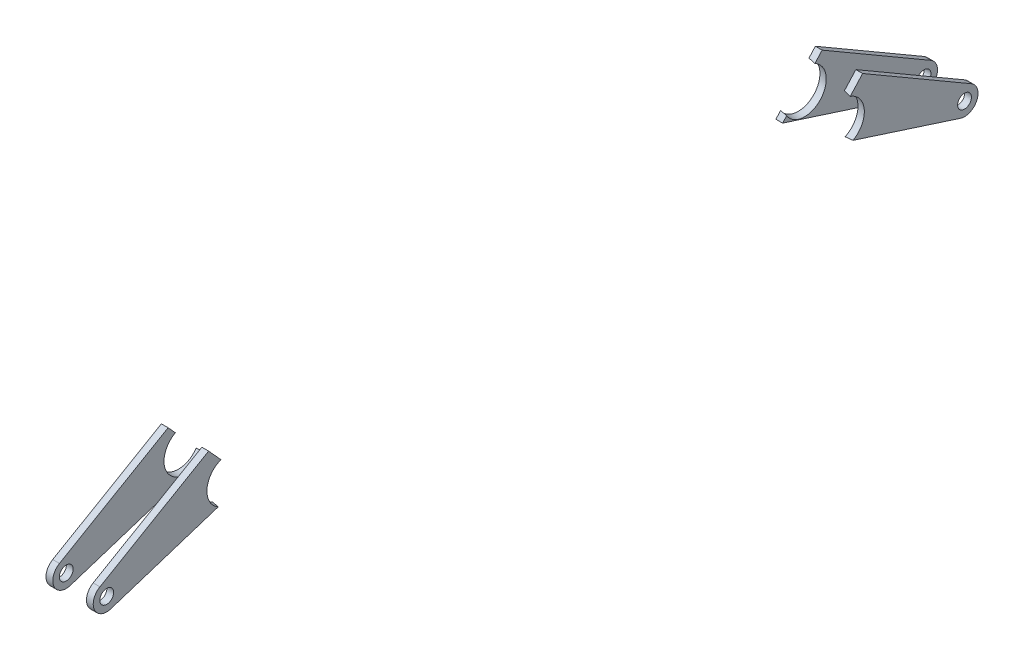
ISO-10303-21;
HEADER;
FILE_DESCRIPTION(('STEP AP214'),'2;1');
FILE_NAME('part.step','',(''),(''),'','','');
FILE_SCHEMA(('AUTOMOTIVE_DESIGN { 1 0 10303 214 1 1 1 1 }'));
ENDSEC;
DATA;
#1=APPLICATION_CONTEXT('core data for automotive mechanical design processes');
#2=APPLICATION_PROTOCOL_DEFINITION('international standard','automotive_design',2000,#1);
#3=PRODUCT_CONTEXT('',#1,'mechanical');
#4=PRODUCT('Part','Part','',(#3));
#5=PRODUCT_RELATED_PRODUCT_CATEGORY('part','',(#4));
#6=PRODUCT_DEFINITION_FORMATION('','',#4);
#7=PRODUCT_DEFINITION_CONTEXT('part definition',#1,'design');
#8=PRODUCT_DEFINITION('design','',#6,#7);
#9=PRODUCT_DEFINITION_SHAPE('','',#8);
#10=(LENGTH_UNIT() NAMED_UNIT(*) SI_UNIT(.MILLI.,.METRE.));
#11=(NAMED_UNIT(*) PLANE_ANGLE_UNIT() SI_UNIT($,.RADIAN.));
#12=(NAMED_UNIT(*) SI_UNIT($,.STERADIAN.) SOLID_ANGLE_UNIT());
#13=UNCERTAINTY_MEASURE_WITH_UNIT(LENGTH_MEASURE(1.E-05),#10,'distance_accuracy_value','');
#14=(GEOMETRIC_REPRESENTATION_CONTEXT(3) GLOBAL_UNCERTAINTY_ASSIGNED_CONTEXT((#13)) GLOBAL_UNIT_ASSIGNED_CONTEXT((#10,
#11,#12)) REPRESENTATION_CONTEXT('',''));
#15=CARTESIAN_POINT('',(0.,0.,0.));
#16=DIRECTION('',(0.,0.,1.));
#17=DIRECTION('',(1.,0.,0.));
#18=AXIS2_PLACEMENT_3D('',#15,#16,#17);
#19=CARTESIAN_POINT('',(946.,190.337125511046,-209.466012456477));
#20=DIRECTION('',(0.,0.672505400933836,-0.740092214331985));
#21=DIRECTION('',(0.,-0.740092214331985,-0.672505400933836));
#22=AXIS2_PLACEMENT_3D('',#19,#20,#21);
#23=PLANE('',#22);
#24=DIRECTION('',(0.,-0.740092214331985,-0.672505400933836));
#25=VECTOR('',#24,1.);
#26=CARTESIAN_POINT('',(950.,190.337125511046,-209.466012456477));
#27=LINE('',#26,#25);
#28=CARTESIAN_POINT('',(950.,611.014843824837,172.794511489047));
#29=VERTEX_POINT('',#28);
#30=CARTESIAN_POINT('',(950.,608.387814650427,170.40738827117));
#31=VERTEX_POINT('',#30);
#32=EDGE_CURVE('E109',#29,#31,#27,.T.);
#33=ORIENTED_EDGE('',*,*,#32,.T.);
#34=DIRECTION('',(1.,0.,0.));
#35=VECTOR('',#34,1.);
#36=CARTESIAN_POINT('',(946.,608.387814650427,170.40738827117));
#37=LINE('',#36,#35);
#38=CARTESIAN_POINT('',(946.,608.387814650427,170.40738827117));
#39=VERTEX_POINT('',#38);
#40=EDGE_CURVE('E146',#39,#31,#37,.T.);
#41=ORIENTED_EDGE('',*,*,#40,.F.);
#42=DIRECTION('',(0.,-0.740092214331985,-0.672505400933836));
#43=VECTOR('',#42,1.);
#44=CARTESIAN_POINT('',(946.,190.337125511046,-209.466012456477));
#45=LINE('',#44,#43);
#46=CARTESIAN_POINT('',(946.,611.448586895078,173.18864420887));
#47=VERTEX_POINT('',#46);
#48=EDGE_CURVE('E144',#47,#39,#45,.T.);
#49=ORIENTED_EDGE('',*,*,#48,.F.);
#50=CARTESIAN_POINT('',(902.408874088127,626.001437412493,186.412497105063));
#51=DIRECTION('',(0.,-0.672505400933836,0.740092214331985));
#52=DIRECTION('',(0.986680698233495,-0.120390051706131,-0.109395773152613));
#53=AXIS2_PLACEMENT_3D('',#50,#51,#52);
#54=ELLIPSE('',#53,188.081374371091,12.7000000000001);
#55=EDGE_CURVE('E118',#29,#47,#54,.F.);
#56=ORIENTED_EDGE('',*,*,#55,.F.);
#57=EDGE_LOOP('',(#33,#41,#49,#56));
#58=FACE_BOUND('',#57,.T.);
#59=ADVANCED_FACE('F50',(#58),#23,.T.);
#60=CARTESIAN_POINT('',(946.,589.782273930001,254.22347738));
#61=DIRECTION('',(1.,0.,0.));
#62=DIRECTION('',(0.,0.,1.));
#63=AXIS2_PLACEMENT_3D('',#60,#61,#62);
#64=CYLINDRICAL_SURFACE('',#63,8.00000000000001);
#65=CARTESIAN_POINT('',(950.,589.782273930001,254.22347738));
#66=DIRECTION('',(1.,0.,0.));
#67=DIRECTION('',(0.,0.,-1.));
#68=AXIS2_PLACEMENT_3D('',#65,#66,#67);
#69=CIRCLE('',#68,8.00000000000001);
#70=CARTESIAN_POINT('',(950.,596.698287663126,258.244516305853));
#71=VERTEX_POINT('',#70);
#72=CARTESIAN_POINT('',(950.,582.167895092533,251.769656905816));
#73=VERTEX_POINT('',#72);
#74=EDGE_CURVE('E149',#71,#73,#69,.T.);
#75=ORIENTED_EDGE('',*,*,#74,.F.);
#76=DIRECTION('',(1.,0.,0.));
#77=VECTOR('',#76,1.);
#78=CARTESIAN_POINT('',(946.,596.698287663126,258.244516305853));
#79=LINE('',#78,#77);
#80=CARTESIAN_POINT('',(946.,596.698287663126,258.244516305853));
#81=VERTEX_POINT('',#80);
#82=EDGE_CURVE('E154',#81,#71,#79,.T.);
#83=ORIENTED_EDGE('',*,*,#82,.F.);
#84=CARTESIAN_POINT('',(946.,589.782273930001,254.22347738));
#85=DIRECTION('',(1.,0.,0.));
#86=DIRECTION('',(0.,0.,-1.));
#87=AXIS2_PLACEMENT_3D('',#84,#85,#86);
#88=CIRCLE('',#87,8.00000000000001);
#89=CARTESIAN_POINT('',(946.,582.167895092533,251.769656905816));
#90=VERTEX_POINT('',#89);
#91=EDGE_CURVE('E126',#81,#90,#88,.T.);
#92=ORIENTED_EDGE('',*,*,#91,.T.);
#93=DIRECTION('',(1.,0.,0.));
#94=VECTOR('',#93,1.);
#95=CARTESIAN_POINT('',(946.,582.167895092533,251.769656905816));
#96=LINE('',#95,#94);
#97=EDGE_CURVE('E143',#90,#73,#96,.T.);
#98=ORIENTED_EDGE('',*,*,#97,.T.);
#99=EDGE_LOOP('',(#75,#83,#92,#98));
#100=FACE_BOUND('',#99,.T.);
#101=ADVANCED_FACE('F164',(#100),#64,.T.);
#102=CARTESIAN_POINT('',(946.,600.898752077459,193.646480196607));
#103=DIRECTION('',(0.,-0.951797354683466,-0.306727559272974));
#104=DIRECTION('',(0.,-0.306727559272974,0.951797354683466));
#105=AXIS2_PLACEMENT_3D('',#102,#103,#104);
#106=PLANE('',#105);
#107=DIRECTION('',(0.,-0.306727559272974,0.951797354683466));
#108=VECTOR('',#107,1.);
#109=CARTESIAN_POINT('',(950.,600.898752077459,193.646480196607));
#110=LINE('',#109,#108);
#111=EDGE_CURVE('E124',#31,#73,#110,.T.);
#112=ORIENTED_EDGE('',*,*,#111,.T.);
#113=ORIENTED_EDGE('',*,*,#97,.F.);
#114=DIRECTION('',(0.,-0.306727559272974,0.951797354683466));
#115=VECTOR('',#114,1.);
#116=CARTESIAN_POINT('',(946.,600.898752077459,193.646480196607));
#117=LINE('',#116,#115);
#118=EDGE_CURVE('E139',#39,#90,#117,.T.);
#119=ORIENTED_EDGE('',*,*,#118,.F.);
#120=ORIENTED_EDGE('',*,*,#40,.T.);
#121=EDGE_LOOP('',(#112,#113,#119,#120));
#122=FACE_BOUND('',#121,.T.);
#123=ADVANCED_FACE('F152',(#122),#106,.T.);
#124=CARTESIAN_POINT('',(946.,634.154667448058,193.821156631259));
#125=VERTEX_POINT('',#124);
#126=CARTESIAN_POINT('',(946.,629.966541176903,190.015499062375));
#127=VERTEX_POINT('',#126);
#128=EDGE_CURVE('E116',#125,#127,#45,.T.);
#129=ORIENTED_EDGE('',*,*,#128,.F.);
#130=DIRECTION('',(1.,0.,0.));
#131=VECTOR('',#130,1.);
#132=CARTESIAN_POINT('',(946.,634.154667448058,193.821156631259));
#133=LINE('',#132,#131);
#134=CARTESIAN_POINT('',(950.,634.154667448058,193.821156631259));
#135=VERTEX_POINT('',#134);
#136=EDGE_CURVE('E120',#125,#135,#133,.T.);
#137=ORIENTED_EDGE('',*,*,#136,.T.);
#138=CARTESIAN_POINT('',(950.,629.428733590305,189.526805221734));
#139=VERTEX_POINT('',#138);
#140=EDGE_CURVE('E54',#135,#139,#27,.T.);
#141=ORIENTED_EDGE('',*,*,#140,.T.);
#142=EDGE_CURVE('E111',#127,#139,#54,.F.);
#143=ORIENTED_EDGE('',*,*,#142,.F.);
#144=EDGE_LOOP('',(#129,#137,#141,#143));
#145=FACE_BOUND('',#144,.T.);
#146=ADVANCED_FACE('F52',(#145),#23,.T.);
#147=CARTESIAN_POINT('',(946.,589.782273930001,254.22347738));
#148=DIRECTION('',(1.,0.,0.));
#149=DIRECTION('',(0.,0.,1.));
#150=AXIS2_PLACEMENT_3D('',#147,#148,#149);
#151=CYLINDRICAL_SURFACE('',#150,4.1);
#152=CARTESIAN_POINT('',(946.,589.782273930001,254.22347738));
#153=DIRECTION('',(1.,0.,0.));
#154=DIRECTION('',(0.,0.,-1.));
#155=AXIS2_PLACEMENT_3D('',#152,#153,#154);
#156=CIRCLE('',#155,4.1);
#157=CARTESIAN_POINT('',(946.,589.782273930001,250.12347738));
#158=VERTEX_POINT('',#157);
#159=EDGE_CURVE('E115',#158,#158,#156,.T.);
#160=ORIENTED_EDGE('',*,*,#159,.F.);
#161=EDGE_LOOP('',(#160));
#162=FACE_BOUND('',#161,.T.);
#163=CARTESIAN_POINT('',(950.,589.782273930001,254.22347738));
#164=DIRECTION('',(1.,0.,0.));
#165=DIRECTION('',(0.,0.,-1.));
#166=AXIS2_PLACEMENT_3D('',#163,#164,#165);
#167=CIRCLE('',#166,4.1);
#168=CARTESIAN_POINT('',(950.,589.782273930001,250.12347738));
#169=VERTEX_POINT('',#168);
#170=EDGE_CURVE('E60',#169,#169,#167,.T.);
#171=ORIENTED_EDGE('',*,*,#170,.T.);
#172=EDGE_LOOP('',(#171));
#173=FACE_BOUND('',#172,.T.);
#174=ADVANCED_FACE('F173',(#162,#173),#151,.F.);
#175=CARTESIAN_POINT('',(946.,558.163891278211,324.522018093342));
#176=DIRECTION('',(0.,0.864501716640661,0.502629865731584));
#177=DIRECTION('',(0.,0.502629865731584,-0.864501716640661));
#178=AXIS2_PLACEMENT_3D('',#175,#176,#177);
#179=PLANE('',#178);
#180=DIRECTION('',(0.,0.502629865731584,-0.864501716640661));
#181=VECTOR('',#180,1.);
#182=CARTESIAN_POINT('',(950.,558.163891278211,324.522018093342));
#183=LINE('',#182,#181);
#184=EDGE_CURVE('E121',#71,#135,#183,.T.);
#185=ORIENTED_EDGE('',*,*,#184,.T.);
#186=ORIENTED_EDGE('',*,*,#136,.F.);
#187=DIRECTION('',(0.,0.502629865731584,-0.864501716640661));
#188=VECTOR('',#187,1.);
#189=CARTESIAN_POINT('',(946.,558.163891278211,324.522018093342));
#190=LINE('',#189,#188);
#191=EDGE_CURVE('E142',#81,#125,#190,.T.);
#192=ORIENTED_EDGE('',*,*,#191,.F.);
#193=ORIENTED_EDGE('',*,*,#82,.T.);
#194=EDGE_LOOP('',(#185,#186,#192,#193));
#195=FACE_BOUND('',#194,.T.);
#196=ADVANCED_FACE('F163',(#195),#179,.T.);
#197=CARTESIAN_POINT('',(946.,0.,0.));
#198=DIRECTION('',(-1.,0.,0.));
#199=DIRECTION('',(0.,0.,-1.));
#200=AXIS2_PLACEMENT_3D('',#197,#198,#199);
#201=PLANE('',#200);
#202=ORIENTED_EDGE('',*,*,#159,.T.);
#203=EDGE_LOOP('',(#202));
#204=FACE_BOUND('',#203,.T.);
#205=ORIENTED_EDGE('',*,*,#48,.T.);
#206=ORIENTED_EDGE('',*,*,#118,.T.);
#207=ORIENTED_EDGE('',*,*,#91,.F.);
#208=ORIENTED_EDGE('',*,*,#191,.T.);
#209=ORIENTED_EDGE('',*,*,#128,.T.);
#210=CARTESIAN_POINT('',(946.,618.671863416998,183.792317703323));
#211=DIRECTION('',(1.,0.,0.));
#212=DIRECTION('',(0.,-0.941641180175466,-0.336618311738614));
#213=AXIS2_PLACEMENT_3D('',#210,#211,#212);
#214=ELLIPSE('',#213,12.9008828713998,12.7000000000001);
#215=EDGE_CURVE('E69',#47,#127,#214,.F.);
#216=ORIENTED_EDGE('',*,*,#215,.F.);
#217=EDGE_LOOP('',(#205,#206,#207,#208,#209,#216));
#218=FACE_BOUND('',#217,.T.);
#219=ADVANCED_FACE('F162',(#204,#218),#201,.T.);
#220=CARTESIAN_POINT('',(950.,0.,0.));
#221=DIRECTION('',(-1.,0.,0.));
#222=DIRECTION('',(0.,0.,-1.));
#223=AXIS2_PLACEMENT_3D('',#220,#221,#222);
#224=PLANE('',#223);
#225=CARTESIAN_POINT('',(950.,617.999288543817,183.551885335777));
#226=DIRECTION('',(1.,0.,0.));
#227=DIRECTION('',(0.,-0.941641180175466,-0.336618311738614));
#228=AXIS2_PLACEMENT_3D('',#225,#226,#227);
#229=ELLIPSE('',#228,12.9008828713998,12.7000000000001);
#230=EDGE_CURVE('E12',#29,#139,#229,.F.);
#231=ORIENTED_EDGE('',*,*,#230,.T.);
#232=ORIENTED_EDGE('',*,*,#140,.F.);
#233=ORIENTED_EDGE('',*,*,#184,.F.);
#234=ORIENTED_EDGE('',*,*,#74,.T.);
#235=ORIENTED_EDGE('',*,*,#111,.F.);
#236=ORIENTED_EDGE('',*,*,#32,.F.);
#237=EDGE_LOOP('',(#231,#232,#233,#234,#235,#236));
#238=FACE_BOUND('',#237,.T.);
#239=ORIENTED_EDGE('',*,*,#170,.F.);
#240=EDGE_LOOP('',(#239));
#241=FACE_BOUND('',#240,.T.);
#242=ADVANCED_FACE('F104',(#238,#241),#224,.F.);
#243=CARTESIAN_POINT('',(773.70714337,647.64182496646,194.148512561002));
#244=DIRECTION('',(0.984428750078415,-0.165525510434835,-0.0591721337652881));
#245=DIRECTION('',(0.165816054290176,0.986156699586652,0.));
#246=AXIS2_PLACEMENT_3D('',#243,#244,#245);
#247=CYLINDRICAL_SURFACE('',#246,12.7000000000001);
#248=ORIENTED_EDGE('',*,*,#55,.T.);
#249=ORIENTED_EDGE('',*,*,#215,.T.);
#250=ORIENTED_EDGE('',*,*,#142,.T.);
#251=ORIENTED_EDGE('',*,*,#230,.F.);
#252=EDGE_LOOP('',(#248,#249,#250,#251));
#253=FACE_BOUND('',#252,.T.);
#254=ADVANCED_FACE('F112',(#253),#247,.F.);
#255=CLOSED_SHELL('',(#59,#101,#123,#146,#174,#196,#219,#242,#254));
#256=MANIFOLD_SOLID_BREP('B2',#255);
#257=CARTESIAN_POINT('',(974.,600.898752077459,193.646480196607));
#258=DIRECTION('',(0.,-0.951797354683466,-0.306727559272974));
#259=DIRECTION('',(0.,-0.306727559272974,0.951797354683466));
#260=AXIS2_PLACEMENT_3D('',#257,#258,#259);
#261=PLANE('',#260);
#262=DIRECTION('',(0.,-0.306727559272974,0.951797354683466));
#263=VECTOR('',#262,1.);
#264=CARTESIAN_POINT('',(974.,600.898752077459,193.646480196607));
#265=LINE('',#264,#263);
#266=CARTESIAN_POINT('',(974.,602.677776966013,188.126039885162));
#267=VERTEX_POINT('',#266);
#268=CARTESIAN_POINT('',(974.,582.167895092533,251.769656905816));
#269=VERTEX_POINT('',#268);
#270=EDGE_CURVE('E265',#267,#269,#265,.T.);
#271=ORIENTED_EDGE('',*,*,#270,.T.);
#272=DIRECTION('',(-1.,0.,0.));
#273=VECTOR('',#272,1.);
#274=CARTESIAN_POINT('',(974.,582.167895092533,251.769656905816));
#275=LINE('',#274,#273);
#276=CARTESIAN_POINT('',(970.,582.167895092533,251.769656905816));
#277=VERTEX_POINT('',#276);
#278=EDGE_CURVE('E323',#269,#277,#275,.T.);
#279=ORIENTED_EDGE('',*,*,#278,.T.);
#280=DIRECTION('',(0.,-0.306727559272974,0.951797354683466));
#281=VECTOR('',#280,1.);
#282=CARTESIAN_POINT('',(970.,600.898752077459,193.646480196607));
#283=LINE('',#282,#281);
#284=CARTESIAN_POINT('',(970.,602.893352526688,187.457093642213));
#285=VERTEX_POINT('',#284);
#286=EDGE_CURVE('E313',#285,#277,#283,.T.);
#287=ORIENTED_EDGE('',*,*,#286,.F.);
#288=CARTESIAN_POINT('',(1023.84739584426,605.582312820149,179.113059280802));
#289=DIRECTION('',(0.,0.951797354683466,0.306727559272974));
#290=DIRECTION('',(0.999984115816622,0.00172881498452154,-0.00536463542077852));
#291=AXIS2_PLACEMENT_3D('',#288,#289,#290);
#292=ELLIPSE('',#291,72.2837528116529,12.7000000000001);
#293=EDGE_CURVE('E318',#267,#285,#292,.F.);
#294=ORIENTED_EDGE('',*,*,#293,.F.);
#295=EDGE_LOOP('',(#271,#279,#287,#294));
#296=FACE_BOUND('',#295,.T.);
#297=ADVANCED_FACE('F261',(#296),#261,.T.);
#298=CARTESIAN_POINT('',(974.,589.782273930001,254.22347738));
#299=DIRECTION('',(-1.,0.,0.));
#300=DIRECTION('',(0.,0.,1.));
#301=AXIS2_PLACEMENT_3D('',#298,#299,#300);
#302=CYLINDRICAL_SURFACE('',#301,8.00000000000001);
#303=CARTESIAN_POINT('',(970.,589.782273930001,254.22347738));
#304=DIRECTION('',(1.,0.,0.));
#305=DIRECTION('',(0.,0.,-1.));
#306=AXIS2_PLACEMENT_3D('',#303,#304,#305);
#307=CIRCLE('',#306,8.00000000000001);
#308=CARTESIAN_POINT('',(970.,596.698287663126,258.244516305853));
#309=VERTEX_POINT('',#308);
#310=EDGE_CURVE('E271',#309,#277,#307,.T.);
#311=ORIENTED_EDGE('',*,*,#310,.T.);
#312=ORIENTED_EDGE('',*,*,#278,.F.);
#313=CARTESIAN_POINT('',(974.,589.782273930001,254.22347738));
#314=DIRECTION('',(1.,0.,0.));
#315=DIRECTION('',(0.,0.,-1.));
#316=AXIS2_PLACEMENT_3D('',#313,#314,#315);
#317=CIRCLE('',#316,8.00000000000001);
#318=CARTESIAN_POINT('',(974.,596.698287663126,258.244516305853));
#319=VERTEX_POINT('',#318);
#320=EDGE_CURVE('E324',#319,#269,#317,.T.);
#321=ORIENTED_EDGE('',*,*,#320,.F.);
#322=DIRECTION('',(-1.,0.,0.));
#323=VECTOR('',#322,1.);
#324=CARTESIAN_POINT('',(974.,596.698287663126,258.244516305853));
#325=LINE('',#324,#323);
#326=EDGE_CURVE('E345',#319,#309,#325,.T.);
#327=ORIENTED_EDGE('',*,*,#326,.T.);
#328=EDGE_LOOP('',(#311,#312,#321,#327));
#329=FACE_BOUND('',#328,.T.);
#330=ADVANCED_FACE('F371',(#329),#302,.T.);
#331=CARTESIAN_POINT('',(974.,190.337125511046,-209.466012456477));
#332=DIRECTION('',(0.,0.672505400933836,-0.740092214331985));
#333=DIRECTION('',(0.,-0.740092214331985,-0.672505400933836));
#334=AXIS2_PLACEMENT_3D('',#331,#332,#333);
#335=PLANE('',#334);
#336=DIRECTION('',(0.,-0.740092214331985,-0.672505400933836));
#337=VECTOR('',#336,1.);
#338=CARTESIAN_POINT('',(970.,190.337125511046,-209.466012456477));
#339=LINE('',#338,#337);
#340=CARTESIAN_POINT('',(970.,634.154667448058,193.821156631259));
#341=VERTEX_POINT('',#340);
#342=CARTESIAN_POINT('',(970.,626.664170616318,187.014708086776));
#343=VERTEX_POINT('',#342);
#344=EDGE_CURVE('E316',#341,#343,#339,.T.);
#345=ORIENTED_EDGE('',*,*,#344,.F.);
#346=DIRECTION('',(-1.,0.,0.));
#347=VECTOR('',#346,1.);
#348=CARTESIAN_POINT('',(974.,634.154667448058,193.821156631259));
#349=LINE('',#348,#347);
#350=CARTESIAN_POINT('',(974.,634.154667448058,193.821156631259));
#351=VERTEX_POINT('',#350);
#352=EDGE_CURVE('E331',#351,#341,#349,.T.);
#353=ORIENTED_EDGE('',*,*,#352,.F.);
#354=DIRECTION('',(0.,-0.740092214331985,-0.672505400933836));
#355=VECTOR('',#354,1.);
#356=CARTESIAN_POINT('',(974.,190.337125511046,-209.466012456477));
#357=LINE('',#356,#355);
#358=CARTESIAN_POINT('',(974.,626.095345290511,186.497829113608));
#359=VERTEX_POINT('',#358);
#360=EDGE_CURVE('E332',#351,#359,#357,.T.);
#361=ORIENTED_EDGE('',*,*,#360,.T.);
#362=CARTESIAN_POINT('',(902.408874088127,626.001437412493,186.412497105063));
#363=DIRECTION('',(0.,-0.672505400933836,0.740092214331985));
#364=DIRECTION('',(0.986680698233495,-0.120390051706131,-0.109395773152613));
#365=AXIS2_PLACEMENT_3D('',#362,#363,#364);
#366=ELLIPSE('',#365,188.081374371091,12.7000000000001);
#367=EDGE_CURVE('E329',#343,#359,#366,.F.);
#368=ORIENTED_EDGE('',*,*,#367,.F.);
#369=EDGE_LOOP('',(#345,#353,#361,#368));
#370=FACE_BOUND('',#369,.T.);
#371=ADVANCED_FACE('F363',(#370),#335,.T.);
#372=CARTESIAN_POINT('',(974.,589.782273930001,254.22347738));
#373=DIRECTION('',(-1.,0.,0.));
#374=DIRECTION('',(0.,0.,1.));
#375=AXIS2_PLACEMENT_3D('',#372,#373,#374);
#376=CYLINDRICAL_SURFACE('',#375,4.1);
#377=CARTESIAN_POINT('',(974.,589.782273930001,254.22347738));
#378=DIRECTION('',(1.,0.,0.));
#379=DIRECTION('',(0.,0.,-1.));
#380=AXIS2_PLACEMENT_3D('',#377,#378,#379);
#381=CIRCLE('',#380,4.1);
#382=CARTESIAN_POINT('',(974.,589.782273930001,250.12347738));
#383=VERTEX_POINT('',#382);
#384=EDGE_CURVE('E334',#383,#383,#381,.T.);
#385=ORIENTED_EDGE('',*,*,#384,.T.);
#386=EDGE_LOOP('',(#385));
#387=FACE_BOUND('',#386,.T.);
#388=CARTESIAN_POINT('',(970.,589.782273930001,254.22347738));
#389=DIRECTION('',(1.,0.,0.));
#390=DIRECTION('',(0.,0.,-1.));
#391=AXIS2_PLACEMENT_3D('',#388,#389,#390);
#392=CIRCLE('',#391,4.1);
#393=CARTESIAN_POINT('',(970.,589.782273930001,250.12347738));
#394=VERTEX_POINT('',#393);
#395=EDGE_CURVE('E342',#394,#394,#392,.T.);
#396=ORIENTED_EDGE('',*,*,#395,.F.);
#397=EDGE_LOOP('',(#396));
#398=FACE_BOUND('',#397,.T.);
#399=ADVANCED_FACE('F360',(#387,#398),#376,.F.);
#400=CARTESIAN_POINT('',(974.,558.163891278211,324.522018093342));
#401=DIRECTION('',(0.,0.864501716640661,0.502629865731584));
#402=DIRECTION('',(0.,0.502629865731584,-0.864501716640661));
#403=AXIS2_PLACEMENT_3D('',#400,#401,#402);
#404=PLANE('',#403);
#405=DIRECTION('',(0.,0.502629865731584,-0.864501716640661));
#406=VECTOR('',#405,1.);
#407=CARTESIAN_POINT('',(970.,558.163891278211,324.522018093342));
#408=LINE('',#407,#406);
#409=EDGE_CURVE('E349',#309,#341,#408,.T.);
#410=ORIENTED_EDGE('',*,*,#409,.F.);
#411=ORIENTED_EDGE('',*,*,#326,.F.);
#412=DIRECTION('',(0.,0.502629865731584,-0.864501716640661));
#413=VECTOR('',#412,1.);
#414=CARTESIAN_POINT('',(974.,558.163891278211,324.522018093342));
#415=LINE('',#414,#413);
#416=EDGE_CURVE('E335',#319,#351,#415,.T.);
#417=ORIENTED_EDGE('',*,*,#416,.T.);
#418=ORIENTED_EDGE('',*,*,#352,.T.);
#419=EDGE_LOOP('',(#410,#411,#417,#418));
#420=FACE_BOUND('',#419,.T.);
#421=ADVANCED_FACE('F362',(#420),#404,.T.);
#422=CARTESIAN_POINT('',(974.,0.,0.));
#423=DIRECTION('',(1.,0.,0.));
#424=DIRECTION('',(0.,0.,-1.));
#425=AXIS2_PLACEMENT_3D('',#422,#423,#424);
#426=PLANE('',#425);
#427=ORIENTED_EDGE('',*,*,#384,.F.);
#428=EDGE_LOOP('',(#427));
#429=FACE_BOUND('',#428,.T.);
#430=ORIENTED_EDGE('',*,*,#360,.F.);
#431=ORIENTED_EDGE('',*,*,#416,.F.);
#432=ORIENTED_EDGE('',*,*,#320,.T.);
#433=ORIENTED_EDGE('',*,*,#270,.F.);
#434=CARTESIAN_POINT('',(974.,613.963839304734,182.109291130505));
#435=DIRECTION('',(-1.,0.,0.));
#436=DIRECTION('',(0.,-0.941641180175466,-0.336618311738614));
#437=AXIS2_PLACEMENT_3D('',#434,#435,#436);
#438=ELLIPSE('',#437,12.9008828713998,12.7000000000001);
#439=EDGE_CURVE('E279',#359,#267,#438,.F.);
#440=ORIENTED_EDGE('',*,*,#439,.F.);
#441=EDGE_LOOP('',(#430,#431,#432,#433,#440));
#442=FACE_BOUND('',#441,.T.);
#443=ADVANCED_FACE('F369',(#429,#442),#426,.T.);
#444=CARTESIAN_POINT('',(970.,0.,0.));
#445=DIRECTION('',(1.,0.,0.));
#446=DIRECTION('',(0.,0.,-1.));
#447=AXIS2_PLACEMENT_3D('',#444,#445,#446);
#448=PLANE('',#447);
#449=CARTESIAN_POINT('',(970.,614.636414177914,182.34972349805));
#450=DIRECTION('',(-1.,0.,0.));
#451=DIRECTION('',(0.,-0.941641180175466,-0.336618311738614));
#452=AXIS2_PLACEMENT_3D('',#449,#450,#451);
#453=ELLIPSE('',#452,12.9008828713998,12.7000000000001);
#454=EDGE_CURVE('E48',#343,#285,#453,.F.);
#455=ORIENTED_EDGE('',*,*,#454,.T.);
#456=ORIENTED_EDGE('',*,*,#286,.T.);
#457=ORIENTED_EDGE('',*,*,#310,.F.);
#458=ORIENTED_EDGE('',*,*,#409,.T.);
#459=ORIENTED_EDGE('',*,*,#344,.T.);
#460=EDGE_LOOP('',(#455,#456,#457,#458,#459));
#461=FACE_BOUND('',#460,.T.);
#462=ORIENTED_EDGE('',*,*,#395,.T.);
#463=EDGE_LOOP('',(#462));
#464=FACE_BOUND('',#463,.T.);
#465=ADVANCED_FACE('F309',(#461,#464),#448,.F.);
#466=CARTESIAN_POINT('',(773.70714337,647.64182496646,194.148512561002));
#467=DIRECTION('',(0.984428750078415,-0.165525510434835,-0.0591721337652881));
#468=DIRECTION('',(0.165816054290176,0.986156699586652,0.));
#469=AXIS2_PLACEMENT_3D('',#466,#467,#468);
#470=CYLINDRICAL_SURFACE('',#469,12.7000000000001);
#471=ORIENTED_EDGE('',*,*,#367,.T.);
#472=ORIENTED_EDGE('',*,*,#439,.T.);
#473=ORIENTED_EDGE('',*,*,#293,.T.);
#474=ORIENTED_EDGE('',*,*,#454,.F.);
#475=EDGE_LOOP('',(#471,#472,#473,#474));
#476=FACE_BOUND('',#475,.T.);
#477=ADVANCED_FACE('F263',(#476),#470,.F.);
#478=CLOSED_SHELL('',(#297,#330,#371,#399,#421,#443,#465,#477));
#479=MANIFOLD_SOLID_BREP('B6',#478);
#480=CARTESIAN_POINT('',(946.,190.337125511046,209.466012456477));
#481=DIRECTION('',(0.,0.672505400933836,0.740092214331985));
#482=DIRECTION('',(0.,-0.740092214331985,0.672505400933836));
#483=AXIS2_PLACEMENT_3D('',#480,#481,#482);
#484=PLANE('',#483);
#485=DIRECTION('',(0.,-0.740092214331985,0.672505400933836));
#486=VECTOR('',#485,1.);
#487=CARTESIAN_POINT('',(950.,190.337125511046,209.466012456477));
#488=LINE('',#487,#486);
#489=CARTESIAN_POINT('',(950.,611.014843824837,-172.794511489047));
#490=VERTEX_POINT('',#489);
#491=CARTESIAN_POINT('',(950.,608.387814650427,-170.40738827117));
#492=VERTEX_POINT('',#491);
#493=EDGE_CURVE('E517',#490,#492,#488,.T.);
#494=ORIENTED_EDGE('',*,*,#493,.F.);
#495=CARTESIAN_POINT('',(902.408874088127,626.001437412493,-186.412497105063));
#496=DIRECTION('',(0.,0.672505400933836,0.740092214331985));
#497=DIRECTION('',(0.986680698233495,-0.120390051706131,0.109395773152613));
#498=AXIS2_PLACEMENT_3D('',#495,#496,#497);
#499=ELLIPSE('',#498,188.081374371091,12.7000000000001);
#500=CARTESIAN_POINT('',(946.,611.448586895078,-173.18864420887));
#501=VERTEX_POINT('',#500);
#502=EDGE_CURVE('E496',#490,#501,#499,.F.);
#503=ORIENTED_EDGE('',*,*,#502,.T.);
#504=DIRECTION('',(0.,-0.740092214331985,0.672505400933836));
#505=VECTOR('',#504,1.);
#506=CARTESIAN_POINT('',(946.,190.337125511046,209.466012456477));
#507=LINE('',#506,#505);
#508=CARTESIAN_POINT('',(946.,608.387814650427,-170.40738827117));
#509=VERTEX_POINT('',#508);
#510=EDGE_CURVE('E541',#501,#509,#507,.T.);
#511=ORIENTED_EDGE('',*,*,#510,.T.);
#512=DIRECTION('',(1.,0.,0.));
#513=VECTOR('',#512,1.);
#514=CARTESIAN_POINT('',(946.,608.387814650427,-170.40738827117));
#515=LINE('',#514,#513);
#516=EDGE_CURVE('E543',#509,#492,#515,.T.);
#517=ORIENTED_EDGE('',*,*,#516,.T.);
#518=EDGE_LOOP('',(#494,#503,#511,#517));
#519=FACE_BOUND('',#518,.T.);
#520=ADVANCED_FACE('F449',(#519),#484,.T.);
#521=CARTESIAN_POINT('',(946.,589.782273930001,-254.22347738));
#522=DIRECTION('',(1.,0.,0.));
#523=DIRECTION('',(0.,0.,-1.));
#524=AXIS2_PLACEMENT_3D('',#521,#522,#523);
#525=CYLINDRICAL_SURFACE('',#524,8.00000000000001);
#526=CARTESIAN_POINT('',(950.,589.782273930001,-254.22347738));
#527=DIRECTION('',(-1.,0.,0.));
#528=DIRECTION('',(0.,0.,1.));
#529=AXIS2_PLACEMENT_3D('',#526,#527,#528);
#530=CIRCLE('',#529,8.00000000000001);
#531=CARTESIAN_POINT('',(950.,596.698287663126,-258.244516305853));
#532=VERTEX_POINT('',#531);
#533=CARTESIAN_POINT('',(950.,582.167895092533,-251.769656905816));
#534=VERTEX_POINT('',#533);
#535=EDGE_CURVE('E547',#532,#534,#530,.T.);
#536=ORIENTED_EDGE('',*,*,#535,.T.);
#537=DIRECTION('',(1.,0.,0.));
#538=VECTOR('',#537,1.);
#539=CARTESIAN_POINT('',(946.,582.167895092533,-251.769656905816));
#540=LINE('',#539,#538);
#541=CARTESIAN_POINT('',(946.,582.167895092533,-251.769656905816));
#542=VERTEX_POINT('',#541);
#543=EDGE_CURVE('E540',#542,#534,#540,.T.);
#544=ORIENTED_EDGE('',*,*,#543,.F.);
#545=CARTESIAN_POINT('',(946.,589.782273930001,-254.22347738));
#546=DIRECTION('',(-1.,0.,0.));
#547=DIRECTION('',(0.,0.,1.));
#548=AXIS2_PLACEMENT_3D('',#545,#546,#547);
#549=CIRCLE('',#548,8.00000000000001);
#550=CARTESIAN_POINT('',(946.,596.698287663126,-258.244516305853));
#551=VERTEX_POINT('',#550);
#552=EDGE_CURVE('E522',#551,#542,#549,.T.);
#553=ORIENTED_EDGE('',*,*,#552,.F.);
#554=DIRECTION('',(1.,0.,0.));
#555=VECTOR('',#554,1.);
#556=CARTESIAN_POINT('',(946.,596.698287663126,-258.244516305853));
#557=LINE('',#556,#555);
#558=EDGE_CURVE('E552',#551,#532,#557,.T.);
#559=ORIENTED_EDGE('',*,*,#558,.T.);
#560=EDGE_LOOP('',(#536,#544,#553,#559));
#561=FACE_BOUND('',#560,.T.);
#562=ADVANCED_FACE('F561',(#561),#525,.T.);
#563=CARTESIAN_POINT('',(946.,600.898752077459,-193.646480196607));
#564=DIRECTION('',(0.,-0.951797354683466,0.306727559272974));
#565=DIRECTION('',(0.,-0.306727559272974,-0.951797354683466));
#566=AXIS2_PLACEMENT_3D('',#563,#564,#565);
#567=PLANE('',#566);
#568=DIRECTION('',(0.,-0.306727559272974,-0.951797354683466));
#569=VECTOR('',#568,1.);
#570=CARTESIAN_POINT('',(950.,600.898752077459,-193.646480196607));
#571=LINE('',#570,#569);
#572=EDGE_CURVE('E520',#492,#534,#571,.T.);
#573=ORIENTED_EDGE('',*,*,#572,.F.);
#574=ORIENTED_EDGE('',*,*,#516,.F.);
#575=DIRECTION('',(0.,-0.306727559272974,-0.951797354683466));
#576=VECTOR('',#575,1.);
#577=CARTESIAN_POINT('',(946.,600.898752077459,-193.646480196607));
#578=LINE('',#577,#576);
#579=EDGE_CURVE('E536',#509,#542,#578,.T.);
#580=ORIENTED_EDGE('',*,*,#579,.T.);
#581=ORIENTED_EDGE('',*,*,#543,.T.);
#582=EDGE_LOOP('',(#573,#574,#580,#581));
#583=FACE_BOUND('',#582,.T.);
#584=ADVANCED_FACE('F563',(#583),#567,.T.);
#585=CARTESIAN_POINT('',(946.,634.154667448058,-193.821156631259));
#586=VERTEX_POINT('',#585);
#587=CARTESIAN_POINT('',(946.,629.966541176903,-190.015499062375));
#588=VERTEX_POINT('',#587);
#589=EDGE_CURVE('E509',#586,#588,#507,.T.);
#590=ORIENTED_EDGE('',*,*,#589,.T.);
#591=CARTESIAN_POINT('',(950.,629.428733590305,-189.526805221734));
#592=VERTEX_POINT('',#591);
#593=EDGE_CURVE('E500',#588,#592,#499,.F.);
#594=ORIENTED_EDGE('',*,*,#593,.T.);
#595=CARTESIAN_POINT('',(950.,634.154667448058,-193.821156631259));
#596=VERTEX_POINT('',#595);
#597=EDGE_CURVE('E453',#596,#592,#488,.T.);
#598=ORIENTED_EDGE('',*,*,#597,.F.);
#599=DIRECTION('',(1.,0.,0.));
#600=VECTOR('',#599,1.);
#601=CARTESIAN_POINT('',(946.,634.154667448058,-193.821156631259));
#602=LINE('',#601,#600);
#603=EDGE_CURVE('E532',#586,#596,#602,.T.);
#604=ORIENTED_EDGE('',*,*,#603,.F.);
#605=EDGE_LOOP('',(#590,#594,#598,#604));
#606=FACE_BOUND('',#605,.T.);
#607=ADVANCED_FACE('F451',(#606),#484,.T.);
#608=CARTESIAN_POINT('',(946.,589.782273930001,-254.22347738));
#609=DIRECTION('',(1.,0.,0.));
#610=DIRECTION('',(0.,0.,-1.));
#611=AXIS2_PLACEMENT_3D('',#608,#609,#610);
#612=CYLINDRICAL_SURFACE('',#611,4.1);
#613=CARTESIAN_POINT('',(946.,589.782273930001,-254.22347738));
#614=DIRECTION('',(-1.,0.,0.));
#615=DIRECTION('',(0.,0.,1.));
#616=AXIS2_PLACEMENT_3D('',#613,#614,#615);
#617=CIRCLE('',#616,4.1);
#618=CARTESIAN_POINT('',(946.,589.782273930001,-250.12347738));
#619=VERTEX_POINT('',#618);
#620=EDGE_CURVE('E510',#619,#619,#617,.T.);
#621=ORIENTED_EDGE('',*,*,#620,.T.);
#622=EDGE_LOOP('',(#621));
#623=FACE_BOUND('',#622,.T.);
#624=CARTESIAN_POINT('',(950.,589.782273930001,-254.22347738));
#625=DIRECTION('',(-1.,0.,0.));
#626=DIRECTION('',(0.,0.,1.));
#627=AXIS2_PLACEMENT_3D('',#624,#625,#626);
#628=CIRCLE('',#627,4.1);
#629=CARTESIAN_POINT('',(950.,589.782273930001,-250.12347738));
#630=VERTEX_POINT('',#629);
#631=EDGE_CURVE('E459',#630,#630,#628,.T.);
#632=ORIENTED_EDGE('',*,*,#631,.F.);
#633=EDGE_LOOP('',(#632));
#634=FACE_BOUND('',#633,.T.);
#635=ADVANCED_FACE('F570',(#623,#634),#612,.F.);
#636=CARTESIAN_POINT('',(946.,558.163891278211,-324.522018093342));
#637=DIRECTION('',(0.,0.864501716640661,-0.502629865731584));
#638=DIRECTION('',(0.,0.502629865731584,0.864501716640661));
#639=AXIS2_PLACEMENT_3D('',#636,#637,#638);
#640=PLANE('',#639);
#641=DIRECTION('',(0.,0.502629865731584,0.864501716640661));
#642=VECTOR('',#641,1.);
#643=CARTESIAN_POINT('',(950.,558.163891278211,-324.522018093342));
#644=LINE('',#643,#642);
#645=EDGE_CURVE('E516',#532,#596,#644,.T.);
#646=ORIENTED_EDGE('',*,*,#645,.F.);
#647=ORIENTED_EDGE('',*,*,#558,.F.);
#648=DIRECTION('',(0.,0.502629865731584,0.864501716640661));
#649=VECTOR('',#648,1.);
#650=CARTESIAN_POINT('',(946.,558.163891278211,-324.522018093342));
#651=LINE('',#650,#649);
#652=EDGE_CURVE('E539',#551,#586,#651,.T.);
#653=ORIENTED_EDGE('',*,*,#652,.T.);
#654=ORIENTED_EDGE('',*,*,#603,.T.);
#655=EDGE_LOOP('',(#646,#647,#653,#654));
#656=FACE_BOUND('',#655,.T.);
#657=ADVANCED_FACE('F560',(#656),#640,.T.);
#658=CARTESIAN_POINT('',(946.,0.,0.));
#659=DIRECTION('',(-1.,0.,0.));
#660=DIRECTION('',(0.,0.,1.));
#661=AXIS2_PLACEMENT_3D('',#658,#659,#660);
#662=PLANE('',#661);
#663=ORIENTED_EDGE('',*,*,#620,.F.);
#664=EDGE_LOOP('',(#663));
#665=FACE_BOUND('',#664,.T.);
#666=ORIENTED_EDGE('',*,*,#510,.F.);
#667=CARTESIAN_POINT('',(946.,618.671863416998,-183.792317703323));
#668=DIRECTION('',(-1.,0.,0.));
#669=DIRECTION('',(0.,-0.941641180175466,0.336618311738614));
#670=AXIS2_PLACEMENT_3D('',#667,#668,#669);
#671=ELLIPSE('',#670,12.9008828713998,12.7000000000001);
#672=EDGE_CURVE('E468',#501,#588,#671,.F.);
#673=ORIENTED_EDGE('',*,*,#672,.T.);
#674=ORIENTED_EDGE('',*,*,#589,.F.);
#675=ORIENTED_EDGE('',*,*,#652,.F.);
#676=ORIENTED_EDGE('',*,*,#552,.T.);
#677=ORIENTED_EDGE('',*,*,#579,.F.);
#678=EDGE_LOOP('',(#666,#673,#674,#675,#676,#677));
#679=FACE_BOUND('',#678,.T.);
#680=ADVANCED_FACE('F549',(#665,#679),#662,.T.);
#681=CARTESIAN_POINT('',(950.,0.,0.));
#682=DIRECTION('',(-1.,0.,0.));
#683=DIRECTION('',(0.,0.,1.));
#684=AXIS2_PLACEMENT_3D('',#681,#682,#683);
#685=PLANE('',#684);
#686=CARTESIAN_POINT('',(950.,617.999288543817,-183.551885335777));
#687=DIRECTION('',(-1.,0.,0.));
#688=DIRECTION('',(0.,-0.941641180175466,0.336618311738614));
#689=AXIS2_PLACEMENT_3D('',#686,#687,#688);
#690=ELLIPSE('',#689,12.9008828713998,12.7000000000001);
#691=EDGE_CURVE('E259',#490,#592,#690,.F.);
#692=ORIENTED_EDGE('',*,*,#691,.F.);
#693=ORIENTED_EDGE('',*,*,#493,.T.);
#694=ORIENTED_EDGE('',*,*,#572,.T.);
#695=ORIENTED_EDGE('',*,*,#535,.F.);
#696=ORIENTED_EDGE('',*,*,#645,.T.);
#697=ORIENTED_EDGE('',*,*,#597,.T.);
#698=EDGE_LOOP('',(#692,#693,#694,#695,#696,#697));
#699=FACE_BOUND('',#698,.T.);
#700=ORIENTED_EDGE('',*,*,#631,.T.);
#701=EDGE_LOOP('',(#700));
#702=FACE_BOUND('',#701,.T.);
#703=ADVANCED_FACE('F512',(#699,#702),#685,.F.);
#704=CARTESIAN_POINT('',(773.70714337,647.64182496646,-194.148512561002));
#705=DIRECTION('',(0.984428750078415,-0.165525510434835,0.0591721337652881));
#706=DIRECTION('',(0.165816054290176,0.986156699586652,0.));
#707=AXIS2_PLACEMENT_3D('',#704,#705,#706);
#708=CYLINDRICAL_SURFACE('',#707,12.7000000000001);
#709=ORIENTED_EDGE('',*,*,#502,.F.);
#710=ORIENTED_EDGE('',*,*,#691,.T.);
#711=ORIENTED_EDGE('',*,*,#593,.F.);
#712=ORIENTED_EDGE('',*,*,#672,.F.);
#713=EDGE_LOOP('',(#709,#710,#711,#712));
#714=FACE_BOUND('',#713,.T.);
#715=ADVANCED_FACE('F499',(#714),#708,.F.);
#716=CLOSED_SHELL('',(#520,#562,#584,#607,#635,#657,#680,#703,#715));
#717=MANIFOLD_SOLID_BREP('B42',#716);
#718=CARTESIAN_POINT('',(974.,600.898752077459,-193.646480196607));
#719=DIRECTION('',(0.,-0.951797354683466,0.306727559272974));
#720=DIRECTION('',(0.,-0.306727559272974,-0.951797354683466));
#721=AXIS2_PLACEMENT_3D('',#718,#719,#720);
#722=PLANE('',#721);
#723=DIRECTION('',(0.,-0.306727559272974,-0.951797354683466));
#724=VECTOR('',#723,1.);
#725=CARTESIAN_POINT('',(974.,600.898752077459,-193.646480196607));
#726=LINE('',#725,#724);
#727=CARTESIAN_POINT('',(974.,602.677776966013,-188.126039885162));
#728=VERTEX_POINT('',#727);
#729=CARTESIAN_POINT('',(974.,582.167895092533,-251.769656905816));
#730=VERTEX_POINT('',#729);
#731=EDGE_CURVE('E654',#728,#730,#726,.T.);
#732=ORIENTED_EDGE('',*,*,#731,.F.);
#733=CARTESIAN_POINT('',(1023.84739584426,605.582312820149,-179.113059280802));
#734=DIRECTION('',(0.,-0.951797354683466,0.306727559272974));
#735=DIRECTION('',(0.999984115816622,0.00172881498452154,0.00536463542077852));
#736=AXIS2_PLACEMENT_3D('',#733,#734,#735);
#737=ELLIPSE('',#736,72.2837528116529,12.7000000000001);
#738=CARTESIAN_POINT('',(970.,602.893352526688,-187.457093642213));
#739=VERTEX_POINT('',#738);
#740=EDGE_CURVE('E694',#728,#739,#737,.F.);
#741=ORIENTED_EDGE('',*,*,#740,.T.);
#742=DIRECTION('',(0.,-0.306727559272974,-0.951797354683466));
#743=VECTOR('',#742,1.);
#744=CARTESIAN_POINT('',(970.,600.898752077459,-193.646480196607));
#745=LINE('',#744,#743);
#746=CARTESIAN_POINT('',(970.,582.167895092533,-251.769656905816));
#747=VERTEX_POINT('',#746);
#748=EDGE_CURVE('E702',#739,#747,#745,.T.);
#749=ORIENTED_EDGE('',*,*,#748,.T.);
#750=DIRECTION('',(-1.,0.,0.));
#751=VECTOR('',#750,1.);
#752=CARTESIAN_POINT('',(974.,582.167895092533,-251.769656905816));
#753=LINE('',#752,#751);
#754=EDGE_CURVE('E712',#730,#747,#753,.T.);
#755=ORIENTED_EDGE('',*,*,#754,.F.);
#756=EDGE_LOOP('',(#732,#741,#749,#755));
#757=FACE_BOUND('',#756,.T.);
#758=ADVANCED_FACE('F650',(#757),#722,.T.);
#759=CARTESIAN_POINT('',(974.,589.782273930001,-254.22347738));
#760=DIRECTION('',(-1.,0.,0.));
#761=DIRECTION('',(0.,0.,-1.));
#762=AXIS2_PLACEMENT_3D('',#759,#760,#761);
#763=CYLINDRICAL_SURFACE('',#762,8.00000000000001);
#764=CARTESIAN_POINT('',(970.,589.782273930001,-254.22347738));
#765=DIRECTION('',(-1.,0.,0.));
#766=DIRECTION('',(0.,0.,1.));
#767=AXIS2_PLACEMENT_3D('',#764,#765,#766);
#768=CIRCLE('',#767,8.00000000000001);
#769=CARTESIAN_POINT('',(970.,596.698287663126,-258.244516305853));
#770=VERTEX_POINT('',#769);
#771=EDGE_CURVE('E660',#770,#747,#768,.T.);
#772=ORIENTED_EDGE('',*,*,#771,.F.);
#773=DIRECTION('',(-1.,0.,0.));
#774=VECTOR('',#773,1.);
#775=CARTESIAN_POINT('',(974.,596.698287663126,-258.244516305853));
#776=LINE('',#775,#774);
#777=CARTESIAN_POINT('',(974.,596.698287663126,-258.244516305853));
#778=VERTEX_POINT('',#777);
#779=EDGE_CURVE('E732',#778,#770,#776,.T.);
#780=ORIENTED_EDGE('',*,*,#779,.F.);
#781=CARTESIAN_POINT('',(974.,589.782273930001,-254.22347738));
#782=DIRECTION('',(-1.,0.,0.));
#783=DIRECTION('',(0.,0.,1.));
#784=AXIS2_PLACEMENT_3D('',#781,#782,#783);
#785=CIRCLE('',#784,8.00000000000001);
#786=EDGE_CURVE('E709',#778,#730,#785,.T.);
#787=ORIENTED_EDGE('',*,*,#786,.T.);
#788=ORIENTED_EDGE('',*,*,#754,.T.);
#789=EDGE_LOOP('',(#772,#780,#787,#788));
#790=FACE_BOUND('',#789,.T.);
#791=ADVANCED_FACE('F745',(#790),#763,.T.);
#792=CARTESIAN_POINT('',(974.,190.337125511046,209.466012456477));
#793=DIRECTION('',(0.,0.672505400933836,0.740092214331985));
#794=DIRECTION('',(0.,-0.740092214331985,0.672505400933836));
#795=AXIS2_PLACEMENT_3D('',#792,#793,#794);
#796=PLANE('',#795);
#797=DIRECTION('',(0.,-0.740092214331985,0.672505400933836));
#798=VECTOR('',#797,1.);
#799=CARTESIAN_POINT('',(970.,190.337125511046,209.466012456477));
#800=LINE('',#799,#798);
#801=CARTESIAN_POINT('',(970.,634.154667448058,-193.821156631259));
#802=VERTEX_POINT('',#801);
#803=CARTESIAN_POINT('',(970.,626.664170616318,-187.014708086776));
#804=VERTEX_POINT('',#803);
#805=EDGE_CURVE('E715',#802,#804,#800,.T.);
#806=ORIENTED_EDGE('',*,*,#805,.T.);
#807=CARTESIAN_POINT('',(902.408874088127,626.001437412493,-186.412497105063));
#808=DIRECTION('',(0.,0.672505400933836,0.740092214331985));
#809=DIRECTION('',(0.986680698233495,-0.120390051706131,0.109395773152613));
#810=AXIS2_PLACEMENT_3D('',#807,#808,#809);
#811=ELLIPSE('',#810,188.081374371091,12.7000000000001);
#812=CARTESIAN_POINT('',(974.,626.095345290511,-186.497829113608));
#813=VERTEX_POINT('',#812);
#814=EDGE_CURVE('E691',#804,#813,#811,.F.);
#815=ORIENTED_EDGE('',*,*,#814,.T.);
#816=DIRECTION('',(0.,-0.740092214331985,0.672505400933836));
#817=VECTOR('',#816,1.);
#818=CARTESIAN_POINT('',(974.,190.337125511046,209.466012456477));
#819=LINE('',#818,#817);
#820=CARTESIAN_POINT('',(974.,634.154667448058,-193.821156631259));
#821=VERTEX_POINT('',#820);
#822=EDGE_CURVE('E719',#821,#813,#819,.T.);
#823=ORIENTED_EDGE('',*,*,#822,.F.);
#824=DIRECTION('',(-1.,0.,0.));
#825=VECTOR('',#824,1.);
#826=CARTESIAN_POINT('',(974.,634.154667448058,-193.821156631259));
#827=LINE('',#826,#825);
#828=EDGE_CURVE('E718',#821,#802,#827,.T.);
#829=ORIENTED_EDGE('',*,*,#828,.T.);
#830=EDGE_LOOP('',(#806,#815,#823,#829));
#831=FACE_BOUND('',#830,.T.);
#832=ADVANCED_FACE('F763',(#831),#796,.T.);
#833=CARTESIAN_POINT('',(974.,589.782273930001,-254.22347738));
#834=DIRECTION('',(-1.,0.,0.));
#835=DIRECTION('',(0.,0.,-1.));
#836=AXIS2_PLACEMENT_3D('',#833,#834,#835);
#837=CYLINDRICAL_SURFACE('',#836,4.1);
#838=CARTESIAN_POINT('',(974.,589.782273930001,-254.22347738));
#839=DIRECTION('',(-1.,0.,0.));
#840=DIRECTION('',(0.,0.,1.));
#841=AXIS2_PLACEMENT_3D('',#838,#839,#840);
#842=CIRCLE('',#841,4.1);
#843=CARTESIAN_POINT('',(974.,589.782273930001,-250.12347738));
#844=VERTEX_POINT('',#843);
#845=EDGE_CURVE('E721',#844,#844,#842,.T.);
#846=ORIENTED_EDGE('',*,*,#845,.F.);
#847=EDGE_LOOP('',(#846));
#848=FACE_BOUND('',#847,.T.);
#849=CARTESIAN_POINT('',(970.,589.782273930001,-254.22347738));
#850=DIRECTION('',(-1.,0.,0.));
#851=DIRECTION('',(0.,0.,1.));
#852=AXIS2_PLACEMENT_3D('',#849,#850,#851);
#853=CIRCLE('',#852,4.1);
#854=CARTESIAN_POINT('',(970.,589.782273930001,-250.12347738));
#855=VERTEX_POINT('',#854);
#856=EDGE_CURVE('E729',#855,#855,#853,.T.);
#857=ORIENTED_EDGE('',*,*,#856,.T.);
#858=EDGE_LOOP('',(#857));
#859=FACE_BOUND('',#858,.T.);
#860=ADVANCED_FACE('F756',(#848,#859),#837,.F.);
#861=CARTESIAN_POINT('',(974.,558.163891278211,-324.522018093342));
#862=DIRECTION('',(0.,0.864501716640661,-0.502629865731584));
#863=DIRECTION('',(0.,0.502629865731584,0.864501716640661));
#864=AXIS2_PLACEMENT_3D('',#861,#862,#863);
#865=PLANE('',#864);
#866=DIRECTION('',(0.,0.502629865731584,0.864501716640661));
#867=VECTOR('',#866,1.);
#868=CARTESIAN_POINT('',(970.,558.163891278211,-324.522018093342));
#869=LINE('',#868,#867);
#870=EDGE_CURVE('E736',#770,#802,#869,.T.);
#871=ORIENTED_EDGE('',*,*,#870,.T.);
#872=ORIENTED_EDGE('',*,*,#828,.F.);
#873=DIRECTION('',(0.,0.502629865731584,0.864501716640661));
#874=VECTOR('',#873,1.);
#875=CARTESIAN_POINT('',(974.,558.163891278211,-324.522018093342));
#876=LINE('',#875,#874);
#877=EDGE_CURVE('E723',#778,#821,#876,.T.);
#878=ORIENTED_EDGE('',*,*,#877,.F.);
#879=ORIENTED_EDGE('',*,*,#779,.T.);
#880=EDGE_LOOP('',(#871,#872,#878,#879));
#881=FACE_BOUND('',#880,.T.);
#882=ADVANCED_FACE('F749',(#881),#865,.T.);
#883=CARTESIAN_POINT('',(974.,0.,0.));
#884=DIRECTION('',(1.,0.,0.));
#885=DIRECTION('',(0.,0.,1.));
#886=AXIS2_PLACEMENT_3D('',#883,#884,#885);
#887=PLANE('',#886);
#888=ORIENTED_EDGE('',*,*,#845,.T.);
#889=EDGE_LOOP('',(#888));
#890=FACE_BOUND('',#889,.T.);
#891=ORIENTED_EDGE('',*,*,#822,.T.);
#892=CARTESIAN_POINT('',(974.,613.963839304734,-182.109291130505));
#893=DIRECTION('',(1.,0.,0.));
#894=DIRECTION('',(0.,-0.941641180175466,0.336618311738614));
#895=AXIS2_PLACEMENT_3D('',#892,#893,#894);
#896=ELLIPSE('',#895,12.9008828713998,12.7000000000001);
#897=EDGE_CURVE('E668',#813,#728,#896,.F.);
#898=ORIENTED_EDGE('',*,*,#897,.T.);
#899=ORIENTED_EDGE('',*,*,#731,.T.);
#900=ORIENTED_EDGE('',*,*,#786,.F.);
#901=ORIENTED_EDGE('',*,*,#877,.T.);
#902=EDGE_LOOP('',(#891,#898,#899,#900,#901));
#903=FACE_BOUND('',#902,.T.);
#904=ADVANCED_FACE('F746',(#890,#903),#887,.T.);
#905=CARTESIAN_POINT('',(970.,0.,0.));
#906=DIRECTION('',(1.,0.,0.));
#907=DIRECTION('',(0.,0.,1.));
#908=AXIS2_PLACEMENT_3D('',#905,#906,#907);
#909=PLANE('',#908);
#910=CARTESIAN_POINT('',(970.,614.636414177914,-182.34972349805));
#911=DIRECTION('',(1.,0.,0.));
#912=DIRECTION('',(0.,-0.941641180175466,0.336618311738614));
#913=AXIS2_PLACEMENT_3D('',#910,#911,#912);
#914=ELLIPSE('',#913,12.9008828713998,12.7000000000001);
#915=EDGE_CURVE('E447',#804,#739,#914,.F.);
#916=ORIENTED_EDGE('',*,*,#915,.F.);
#917=ORIENTED_EDGE('',*,*,#805,.F.);
#918=ORIENTED_EDGE('',*,*,#870,.F.);
#919=ORIENTED_EDGE('',*,*,#771,.T.);
#920=ORIENTED_EDGE('',*,*,#748,.F.);
#921=EDGE_LOOP('',(#916,#917,#918,#919,#920));
#922=FACE_BOUND('',#921,.T.);
#923=ORIENTED_EDGE('',*,*,#856,.F.);
#924=EDGE_LOOP('',(#923));
#925=FACE_BOUND('',#924,.T.);
#926=ADVANCED_FACE('F706',(#922,#925),#909,.F.);
#927=CARTESIAN_POINT('',(773.70714337,647.64182496646,-194.148512561002));
#928=DIRECTION('',(0.984428750078415,-0.165525510434835,0.0591721337652881));
#929=DIRECTION('',(0.165816054290176,0.986156699586652,0.));
#930=AXIS2_PLACEMENT_3D('',#927,#928,#929);
#931=CYLINDRICAL_SURFACE('',#930,12.7000000000001);
#932=ORIENTED_EDGE('',*,*,#814,.F.);
#933=ORIENTED_EDGE('',*,*,#915,.T.);
#934=ORIENTED_EDGE('',*,*,#740,.F.);
#935=ORIENTED_EDGE('',*,*,#897,.F.);
#936=EDGE_LOOP('',(#932,#933,#934,#935));
#937=FACE_BOUND('',#936,.T.);
#938=ADVANCED_FACE('F652',(#937),#931,.F.);
#939=CLOSED_SHELL('',(#758,#791,#832,#860,#882,#904,#926,#938));
#940=MANIFOLD_SOLID_BREP('B253',#939);
#941=ADVANCED_BREP_SHAPE_REPRESENTATION('',(#18,#256,#479,#717,#940),#14);
#942=SHAPE_DEFINITION_REPRESENTATION(#9,#941);
ENDSEC;
END-ISO-10303-21;
